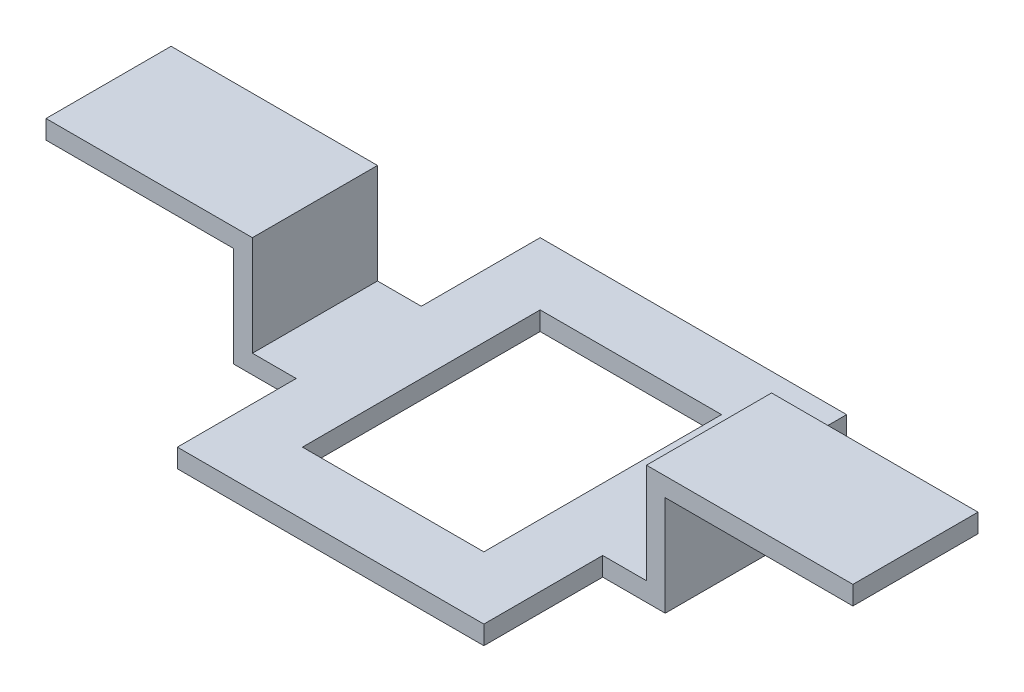
ISO-10303-21;
HEADER;
FILE_DESCRIPTION(('STEP AP214'),'2;1');
FILE_NAME('part.step','',(''),(''),'','','');
FILE_SCHEMA(('AUTOMOTIVE_DESIGN { 1 0 10303 214 1 1 1 1 }'));
ENDSEC;
DATA;
#1=APPLICATION_CONTEXT('core data for automotive mechanical design processes');
#2=APPLICATION_PROTOCOL_DEFINITION('international standard','automotive_design',2000,#1);
#3=PRODUCT_CONTEXT('',#1,'mechanical');
#4=PRODUCT('Part','Part','',(#3));
#5=PRODUCT_RELATED_PRODUCT_CATEGORY('part','',(#4));
#6=PRODUCT_DEFINITION_FORMATION('','',#4);
#7=PRODUCT_DEFINITION_CONTEXT('part definition',#1,'design');
#8=PRODUCT_DEFINITION('design','',#6,#7);
#9=PRODUCT_DEFINITION_SHAPE('','',#8);
#10=(LENGTH_UNIT() NAMED_UNIT(*) SI_UNIT(.MILLI.,.METRE.));
#11=(NAMED_UNIT(*) PLANE_ANGLE_UNIT() SI_UNIT($,.RADIAN.));
#12=(NAMED_UNIT(*) SI_UNIT($,.STERADIAN.) SOLID_ANGLE_UNIT());
#13=UNCERTAINTY_MEASURE_WITH_UNIT(LENGTH_MEASURE(1.E-05),#10,'distance_accuracy_value','');
#14=(GEOMETRIC_REPRESENTATION_CONTEXT(3) GLOBAL_UNCERTAINTY_ASSIGNED_CONTEXT((#13)) GLOBAL_UNIT_ASSIGNED_CONTEXT((#10,
#11,#12)) REPRESENTATION_CONTEXT('',''));
#15=CARTESIAN_POINT('',(0.,0.,0.));
#16=DIRECTION('',(0.,0.,1.));
#17=DIRECTION('',(1.,0.,0.));
#18=AXIS2_PLACEMENT_3D('',#15,#16,#17);
#19=CARTESIAN_POINT('',(34.4999999999998,0.,0.));
#20=DIRECTION('',(1.,0.,0.));
#21=DIRECTION('',(0.,0.,1.));
#22=AXIS2_PLACEMENT_3D('',#19,#20,#21);
#23=PLANE('',#22);
#24=DIRECTION('',(0.,-1.,0.));
#25=VECTOR('',#24,1.);
#26=CARTESIAN_POINT('',(34.4999999999998,3.,-10.));
#27=LINE('',#26,#25);
#28=CARTESIAN_POINT('',(34.4999999999998,16.,-10.));
#29=VERTEX_POINT('',#28);
#30=CARTESIAN_POINT('',(34.4999999999998,0.,-10.));
#31=VERTEX_POINT('',#30);
#32=EDGE_CURVE('E248',#29,#31,#27,.T.);
#33=ORIENTED_EDGE('',*,*,#32,.F.);
#34=DIRECTION('',(0.,0.,1.));
#35=VECTOR('',#34,1.);
#36=CARTESIAN_POINT('',(34.4999999999998,16.,-10.));
#37=LINE('',#36,#35);
#38=CARTESIAN_POINT('',(34.4999999999998,16.,9.99999999999996));
#39=VERTEX_POINT('',#38);
#40=EDGE_CURVE('E220',#29,#39,#37,.T.);
#41=ORIENTED_EDGE('',*,*,#40,.T.);
#42=DIRECTION('',(0.,1.,0.));
#43=VECTOR('',#42,1.);
#44=CARTESIAN_POINT('',(34.4999999999998,0.,9.99999999999997));
#45=LINE('',#44,#43);
#46=CARTESIAN_POINT('',(34.4999999999998,0.,9.99999999999997));
#47=VERTEX_POINT('',#46);
#48=EDGE_CURVE('E241',#47,#39,#45,.T.);
#49=ORIENTED_EDGE('',*,*,#48,.F.);
#50=DIRECTION('',(0.,0.,1.));
#51=VECTOR('',#50,1.);
#52=CARTESIAN_POINT('',(34.4999999999998,0.,-10.));
#53=LINE('',#52,#51);
#54=EDGE_CURVE('E244',#31,#47,#53,.T.);
#55=ORIENTED_EDGE('',*,*,#54,.F.);
#56=EDGE_LOOP('',(#33,#41,#49,#55));
#57=FACE_BOUND('',#56,.T.);
#58=ADVANCED_FACE('F35',(#57),#23,.T.);
#59=CARTESIAN_POINT('',(24.5000000000001,3.,-28.9999999999999));
#60=DIRECTION('',(-1.,0.,0.));
#61=DIRECTION('',(0.,0.,1.));
#62=AXIS2_PLACEMENT_3D('',#59,#60,#61);
#63=PLANE('',#62);
#64=DIRECTION('',(0.,0.,-1.));
#65=VECTOR('',#64,1.);
#66=CARTESIAN_POINT('',(24.5000000000001,0.,-28.9999999999999));
#67=LINE('',#66,#65);
#68=CARTESIAN_POINT('',(24.5000000000001,0.,29.0000000000001));
#69=VERTEX_POINT('',#68);
#70=CARTESIAN_POINT('',(24.4999999999998,0.,9.99999999999998));
#71=VERTEX_POINT('',#70);
#72=EDGE_CURVE('E363',#69,#71,#67,.T.);
#73=ORIENTED_EDGE('',*,*,#72,.T.);
#74=DIRECTION('',(0.,1.,0.));
#75=VECTOR('',#74,1.);
#76=CARTESIAN_POINT('',(24.4999999999998,0.,9.99999999999998));
#77=LINE('',#76,#75);
#78=CARTESIAN_POINT('',(24.4999999999998,3.,9.99999999999997));
#79=VERTEX_POINT('',#78);
#80=EDGE_CURVE('E240',#71,#79,#77,.T.);
#81=ORIENTED_EDGE('',*,*,#80,.T.);
#82=DIRECTION('',(0.,0.,-1.));
#83=VECTOR('',#82,1.);
#84=CARTESIAN_POINT('',(24.5000000000001,3.,-28.9999999999999));
#85=LINE('',#84,#83);
#86=CARTESIAN_POINT('',(24.5000000000001,3.,29.0000000000001));
#87=VERTEX_POINT('',#86);
#88=EDGE_CURVE('E351',#87,#79,#85,.T.);
#89=ORIENTED_EDGE('',*,*,#88,.F.);
#90=DIRECTION('',(0.,-1.,0.));
#91=VECTOR('',#90,1.);
#92=CARTESIAN_POINT('',(24.5000000000001,3.,29.0000000000001));
#93=LINE('',#92,#91);
#94=EDGE_CURVE('E362',#87,#69,#93,.T.);
#95=ORIENTED_EDGE('',*,*,#94,.T.);
#96=EDGE_LOOP('',(#73,#81,#89,#95));
#97=FACE_BOUND('',#96,.T.);
#98=ADVANCED_FACE('F415',(#97),#63,.F.);
#99=CARTESIAN_POINT('',(-24.4999999999998,3.,-28.9999999999999));
#100=DIRECTION('',(1.,0.,0.));
#101=DIRECTION('',(0.,0.,-1.));
#102=AXIS2_PLACEMENT_3D('',#99,#100,#101);
#103=PLANE('',#102);
#104=DIRECTION('',(0.,1.,0.));
#105=VECTOR('',#104,1.);
#106=CARTESIAN_POINT('',(-24.4999999999998,0.,9.99999999999998));
#107=LINE('',#106,#105);
#108=CARTESIAN_POINT('',(-24.4999999999998,0.,9.99999999999996));
#109=VERTEX_POINT('',#108);
#110=CARTESIAN_POINT('',(-24.4999999999998,3.,9.99999999999996));
#111=VERTEX_POINT('',#110);
#112=EDGE_CURVE('E296',#109,#111,#107,.T.);
#113=ORIENTED_EDGE('',*,*,#112,.F.);
#114=DIRECTION('',(0.,0.,1.));
#115=VECTOR('',#114,1.);
#116=CARTESIAN_POINT('',(-24.4999999999998,0.,-28.9999999999999));
#117=LINE('',#116,#115);
#118=CARTESIAN_POINT('',(-24.4999999999999,0.,29.0000000000001));
#119=VERTEX_POINT('',#118);
#120=EDGE_CURVE('E368',#109,#119,#117,.T.);
#121=ORIENTED_EDGE('',*,*,#120,.T.);
#122=DIRECTION('',(0.,-1.,0.));
#123=VECTOR('',#122,1.);
#124=CARTESIAN_POINT('',(-24.4999999999999,3.,29.0000000000001));
#125=LINE('',#124,#123);
#126=CARTESIAN_POINT('',(-24.4999999999999,3.,29.0000000000001));
#127=VERTEX_POINT('',#126);
#128=EDGE_CURVE('E375',#127,#119,#125,.T.);
#129=ORIENTED_EDGE('',*,*,#128,.F.);
#130=DIRECTION('',(0.,0.,1.));
#131=VECTOR('',#130,1.);
#132=CARTESIAN_POINT('',(-24.4999999999998,3.,-28.9999999999999));
#133=LINE('',#132,#131);
#134=EDGE_CURVE('E356',#111,#127,#133,.T.);
#135=ORIENTED_EDGE('',*,*,#134,.F.);
#136=EDGE_LOOP('',(#113,#121,#129,#135));
#137=FACE_BOUND('',#136,.T.);
#138=ADVANCED_FACE('F424',(#137),#103,.F.);
#139=DIRECTION('',(0.,-1.,0.));
#140=VECTOR('',#139,1.);
#141=CARTESIAN_POINT('',(-24.4999999999998,3.,-10.));
#142=LINE('',#141,#140);
#143=CARTESIAN_POINT('',(-24.4999999999998,3.,-10.));
#144=VERTEX_POINT('',#143);
#145=CARTESIAN_POINT('',(-24.4999999999998,0.,-10.));
#146=VERTEX_POINT('',#145);
#147=EDGE_CURVE('E300',#144,#146,#142,.T.);
#148=ORIENTED_EDGE('',*,*,#147,.F.);
#149=CARTESIAN_POINT('',(-24.4999999999998,3.,-28.9999999999999));
#150=VERTEX_POINT('',#149);
#151=EDGE_CURVE('E357',#150,#144,#133,.T.);
#152=ORIENTED_EDGE('',*,*,#151,.F.);
#153=DIRECTION('',(0.,-1.,0.));
#154=VECTOR('',#153,1.);
#155=CARTESIAN_POINT('',(-24.4999999999998,3.,-28.9999999999999));
#156=LINE('',#155,#154);
#157=CARTESIAN_POINT('',(-24.4999999999998,0.,-28.9999999999999));
#158=VERTEX_POINT('',#157);
#159=EDGE_CURVE('E43',#150,#158,#156,.T.);
#160=ORIENTED_EDGE('',*,*,#159,.T.);
#161=EDGE_CURVE('E369',#158,#146,#117,.T.);
#162=ORIENTED_EDGE('',*,*,#161,.T.);
#163=EDGE_LOOP('',(#148,#152,#160,#162));
#164=FACE_BOUND('',#163,.T.);
#165=ADVANCED_FACE('F383',(#164),#103,.F.);
#166=CARTESIAN_POINT('',(24.4999999999998,3.,-10.));
#167=VERTEX_POINT('',#166);
#168=CARTESIAN_POINT('',(24.5000000000001,3.,-28.9999999999999));
#169=VERTEX_POINT('',#168);
#170=EDGE_CURVE('E354',#167,#169,#85,.T.);
#171=ORIENTED_EDGE('',*,*,#170,.F.);
#172=DIRECTION('',(0.,-1.,0.));
#173=VECTOR('',#172,1.);
#174=CARTESIAN_POINT('',(24.4999999999998,3.,-10.));
#175=LINE('',#174,#173);
#176=CARTESIAN_POINT('',(24.5000000000001,0.,-10.));
#177=VERTEX_POINT('',#176);
#178=EDGE_CURVE('E245',#167,#177,#175,.T.);
#179=ORIENTED_EDGE('',*,*,#178,.T.);
#180=CARTESIAN_POINT('',(24.5000000000001,0.,-28.9999999999999));
#181=VERTEX_POINT('',#180);
#182=EDGE_CURVE('E344',#177,#181,#67,.T.);
#183=ORIENTED_EDGE('',*,*,#182,.T.);
#184=DIRECTION('',(0.,-1.,0.));
#185=VECTOR('',#184,1.);
#186=CARTESIAN_POINT('',(24.5000000000001,3.,-28.9999999999999));
#187=LINE('',#186,#185);
#188=EDGE_CURVE('E11',#169,#181,#187,.T.);
#189=ORIENTED_EDGE('',*,*,#188,.F.);
#190=EDGE_LOOP('',(#171,#179,#183,#189));
#191=FACE_BOUND('',#190,.T.);
#192=ADVANCED_FACE('F37',(#191),#63,.F.);
#193=CARTESIAN_POINT('',(-24.4999999999998,3.,-28.9999999999999));
#194=DIRECTION('',(0.,0.,1.));
#195=DIRECTION('',(1.,0.,0.));
#196=AXIS2_PLACEMENT_3D('',#193,#194,#195);
#197=PLANE('',#196);
#198=DIRECTION('',(-1.,0.,0.));
#199=VECTOR('',#198,1.);
#200=CARTESIAN_POINT('',(-24.4999999999998,0.,-28.9999999999999));
#201=LINE('',#200,#199);
#202=EDGE_CURVE('E366',#181,#158,#201,.T.);
#203=ORIENTED_EDGE('',*,*,#202,.T.);
#204=ORIENTED_EDGE('',*,*,#159,.F.);
#205=DIRECTION('',(-1.,0.,0.));
#206=VECTOR('',#205,1.);
#207=CARTESIAN_POINT('',(-24.4999999999998,3.,-28.9999999999999));
#208=LINE('',#207,#206);
#209=EDGE_CURVE('E353',#169,#150,#208,.T.);
#210=ORIENTED_EDGE('',*,*,#209,.F.);
#211=ORIENTED_EDGE('',*,*,#188,.T.);
#212=EDGE_LOOP('',(#203,#204,#210,#211));
#213=FACE_BOUND('',#212,.T.);
#214=ADVANCED_FACE('F402',(#213),#197,.F.);
#215=CARTESIAN_POINT('',(-24.4999999999999,3.,29.0000000000001));
#216=DIRECTION('',(0.,0.,-1.));
#217=DIRECTION('',(-1.,0.,0.));
#218=AXIS2_PLACEMENT_3D('',#215,#216,#217);
#219=PLANE('',#218);
#220=DIRECTION('',(1.,0.,0.));
#221=VECTOR('',#220,1.);
#222=CARTESIAN_POINT('',(-24.4999999999999,0.,29.0000000000001));
#223=LINE('',#222,#221);
#224=EDGE_CURVE('E371',#119,#69,#223,.T.);
#225=ORIENTED_EDGE('',*,*,#224,.T.);
#226=ORIENTED_EDGE('',*,*,#94,.F.);
#227=DIRECTION('',(1.,0.,0.));
#228=VECTOR('',#227,1.);
#229=CARTESIAN_POINT('',(-24.4999999999999,3.,29.0000000000001));
#230=LINE('',#229,#228);
#231=EDGE_CURVE('E360',#127,#87,#230,.T.);
#232=ORIENTED_EDGE('',*,*,#231,.F.);
#233=ORIENTED_EDGE('',*,*,#128,.T.);
#234=EDGE_LOOP('',(#225,#226,#232,#233));
#235=FACE_BOUND('',#234,.T.);
#236=ADVANCED_FACE('F420',(#235),#219,.F.);
#237=CARTESIAN_POINT('',(0.,3.,0.));
#238=DIRECTION('',(0.,1.,0.));
#239=DIRECTION('',(0.,0.,1.));
#240=AXIS2_PLACEMENT_3D('',#237,#238,#239);
#241=PLANE('',#240);
#242=DIRECTION('',(0.,0.,-1.));
#243=VECTOR('',#242,1.);
#244=CARTESIAN_POINT('',(31.4999999999998,3.,-10.));
#245=LINE('',#244,#243);
#246=CARTESIAN_POINT('',(31.4999999999998,3.,9.99999999999997));
#247=VERTEX_POINT('',#246);
#248=CARTESIAN_POINT('',(31.4999999999998,3.,-10.));
#249=VERTEX_POINT('',#248);
#250=EDGE_CURVE('E211',#247,#249,#245,.T.);
#251=ORIENTED_EDGE('',*,*,#250,.T.);
#252=DIRECTION('',(-1.,0.,0.));
#253=VECTOR('',#252,1.);
#254=CARTESIAN_POINT('',(34.4999999999998,3.,-10.));
#255=LINE('',#254,#253);
#256=EDGE_CURVE('E255',#249,#167,#255,.T.);
#257=ORIENTED_EDGE('',*,*,#256,.T.);
#258=ORIENTED_EDGE('',*,*,#170,.T.);
#259=ORIENTED_EDGE('',*,*,#209,.T.);
#260=ORIENTED_EDGE('',*,*,#151,.T.);
#261=DIRECTION('',(1.,0.,0.));
#262=VECTOR('',#261,1.);
#263=CARTESIAN_POINT('',(-34.4999999999998,3.,-10.));
#264=LINE('',#263,#262);
#265=CARTESIAN_POINT('',(-31.4999999999998,3.,-10.));
#266=VERTEX_POINT('',#265);
#267=EDGE_CURVE('E314',#266,#144,#264,.T.);
#268=ORIENTED_EDGE('',*,*,#267,.F.);
#269=DIRECTION('',(0.,0.,-1.));
#270=VECTOR('',#269,1.);
#271=CARTESIAN_POINT('',(-31.4999999999998,3.,-10.));
#272=LINE('',#271,#270);
#273=CARTESIAN_POINT('',(-31.4999999999998,3.,9.99999999999997));
#274=VERTEX_POINT('',#273);
#275=EDGE_CURVE('E281',#274,#266,#272,.T.);
#276=ORIENTED_EDGE('',*,*,#275,.F.);
#277=DIRECTION('',(1.,0.,0.));
#278=VECTOR('',#277,1.);
#279=CARTESIAN_POINT('',(-34.4999999999998,3.,9.99999999999996));
#280=LINE('',#279,#278);
#281=EDGE_CURVE('E316',#274,#111,#280,.T.);
#282=ORIENTED_EDGE('',*,*,#281,.T.);
#283=ORIENTED_EDGE('',*,*,#134,.T.);
#284=ORIENTED_EDGE('',*,*,#231,.T.);
#285=ORIENTED_EDGE('',*,*,#88,.T.);
#286=DIRECTION('',(-1.,0.,0.));
#287=VECTOR('',#286,1.);
#288=CARTESIAN_POINT('',(34.4999999999998,3.,9.99999999999996));
#289=LINE('',#288,#287);
#290=EDGE_CURVE('E58',#247,#79,#289,.T.);
#291=ORIENTED_EDGE('',*,*,#290,.F.);
#292=EDGE_LOOP('',(#251,#257,#258,#259,#260,#268,#276,#282,#283,#284,#285,#291));
#293=FACE_BOUND('',#292,.T.);
#294=DIRECTION('',(0.,0.,-1.));
#295=VECTOR('',#294,1.);
#296=CARTESIAN_POINT('',(14.5,3.,-19.));
#297=LINE('',#296,#295);
#298=CARTESIAN_POINT('',(14.5,3.,19.));
#299=VERTEX_POINT('',#298);
#300=CARTESIAN_POINT('',(14.5,3.,-19.));
#301=VERTEX_POINT('',#300);
#302=EDGE_CURVE('E318',#299,#301,#297,.T.);
#303=ORIENTED_EDGE('',*,*,#302,.F.);
#304=DIRECTION('',(1.,0.,0.));
#305=VECTOR('',#304,1.);
#306=CARTESIAN_POINT('',(-14.5,3.,19.));
#307=LINE('',#306,#305);
#308=CARTESIAN_POINT('',(-14.5,3.,19.));
#309=VERTEX_POINT('',#308);
#310=EDGE_CURVE('E323',#309,#299,#307,.T.);
#311=ORIENTED_EDGE('',*,*,#310,.F.);
#312=DIRECTION('',(0.,0.,1.));
#313=VECTOR('',#312,1.);
#314=CARTESIAN_POINT('',(-14.5,3.,-19.));
#315=LINE('',#314,#313);
#316=CARTESIAN_POINT('',(-14.5,3.,-19.));
#317=VERTEX_POINT('',#316);
#318=EDGE_CURVE('E337',#317,#309,#315,.T.);
#319=ORIENTED_EDGE('',*,*,#318,.F.);
#320=DIRECTION('',(-1.,0.,0.));
#321=VECTOR('',#320,1.);
#322=CARTESIAN_POINT('',(-14.5,3.,-19.));
#323=LINE('',#322,#321);
#324=EDGE_CURVE('E334',#301,#317,#323,.T.);
#325=ORIENTED_EDGE('',*,*,#324,.F.);
#326=EDGE_LOOP('',(#303,#311,#319,#325));
#327=FACE_BOUND('',#326,.T.);
#328=ADVANCED_FACE('F398',(#293,#327),#241,.T.);
#329=CARTESIAN_POINT('',(0.,0.,0.));
#330=DIRECTION('',(0.,1.,0.));
#331=DIRECTION('',(0.,0.,1.));
#332=AXIS2_PLACEMENT_3D('',#329,#330,#331);
#333=PLANE('',#332);
#334=DIRECTION('',(1.,0.,0.));
#335=VECTOR('',#334,1.);
#336=CARTESIAN_POINT('',(-14.5,0.,19.));
#337=LINE('',#336,#335);
#338=CARTESIAN_POINT('',(-14.5,0.,19.));
#339=VERTEX_POINT('',#338);
#340=CARTESIAN_POINT('',(14.5,0.,19.));
#341=VERTEX_POINT('',#340);
#342=EDGE_CURVE('E329',#339,#341,#337,.T.);
#343=ORIENTED_EDGE('',*,*,#342,.T.);
#344=DIRECTION('',(0.,0.,-1.));
#345=VECTOR('',#344,1.);
#346=CARTESIAN_POINT('',(14.5,0.,-19.));
#347=LINE('',#346,#345);
#348=CARTESIAN_POINT('',(14.5,0.,-19.));
#349=VERTEX_POINT('',#348);
#350=EDGE_CURVE('E319',#341,#349,#347,.T.);
#351=ORIENTED_EDGE('',*,*,#350,.T.);
#352=DIRECTION('',(-1.,0.,0.));
#353=VECTOR('',#352,1.);
#354=CARTESIAN_POINT('',(-14.5,0.,-19.));
#355=LINE('',#354,#353);
#356=CARTESIAN_POINT('',(-14.5,0.,-19.));
#357=VERTEX_POINT('',#356);
#358=EDGE_CURVE('E322',#349,#357,#355,.T.);
#359=ORIENTED_EDGE('',*,*,#358,.T.);
#360=DIRECTION('',(0.,0.,1.));
#361=VECTOR('',#360,1.);
#362=CARTESIAN_POINT('',(-14.5,0.,-19.));
#363=LINE('',#362,#361);
#364=EDGE_CURVE('E326',#357,#339,#363,.T.);
#365=ORIENTED_EDGE('',*,*,#364,.T.);
#366=EDGE_LOOP('',(#343,#351,#359,#365));
#367=FACE_BOUND('',#366,.T.);
#368=ORIENTED_EDGE('',*,*,#72,.F.);
#369=ORIENTED_EDGE('',*,*,#224,.F.);
#370=ORIENTED_EDGE('',*,*,#120,.F.);
#371=DIRECTION('',(1.,0.,0.));
#372=VECTOR('',#371,1.);
#373=CARTESIAN_POINT('',(-34.4999999999998,0.,9.99999999999997));
#374=LINE('',#373,#372);
#375=CARTESIAN_POINT('',(-34.4999999999998,0.,9.99999999999997));
#376=VERTEX_POINT('',#375);
#377=EDGE_CURVE('E304',#376,#109,#374,.T.);
#378=ORIENTED_EDGE('',*,*,#377,.F.);
#379=DIRECTION('',(0.,0.,1.));
#380=VECTOR('',#379,1.);
#381=CARTESIAN_POINT('',(-34.4999999999998,0.,-10.));
#382=LINE('',#381,#380);
#383=CARTESIAN_POINT('',(-34.4999999999998,0.,-10.));
#384=VERTEX_POINT('',#383);
#385=EDGE_CURVE('E302',#384,#376,#382,.T.);
#386=ORIENTED_EDGE('',*,*,#385,.F.);
#387=DIRECTION('',(1.,0.,0.));
#388=VECTOR('',#387,1.);
#389=CARTESIAN_POINT('',(-34.4999999999998,0.,-10.));
#390=LINE('',#389,#388);
#391=EDGE_CURVE('E311',#384,#146,#390,.T.);
#392=ORIENTED_EDGE('',*,*,#391,.T.);
#393=ORIENTED_EDGE('',*,*,#161,.F.);
#394=ORIENTED_EDGE('',*,*,#202,.F.);
#395=ORIENTED_EDGE('',*,*,#182,.F.);
#396=DIRECTION('',(-1.,0.,0.));
#397=VECTOR('',#396,1.);
#398=CARTESIAN_POINT('',(34.4999999999998,0.,-10.));
#399=LINE('',#398,#397);
#400=EDGE_CURVE('E257',#31,#177,#399,.T.);
#401=ORIENTED_EDGE('',*,*,#400,.F.);
#402=ORIENTED_EDGE('',*,*,#54,.T.);
#403=DIRECTION('',(-1.,0.,0.));
#404=VECTOR('',#403,1.);
#405=CARTESIAN_POINT('',(34.4999999999998,0.,9.99999999999997));
#406=LINE('',#405,#404);
#407=EDGE_CURVE('E259',#47,#71,#406,.T.);
#408=ORIENTED_EDGE('',*,*,#407,.T.);
#409=EDGE_LOOP('',(#368,#369,#370,#378,#386,#392,#393,#394,#395,#401,#402,#408));
#410=FACE_BOUND('',#409,.T.);
#411=ADVANCED_FACE('F389',(#367,#410),#333,.F.);
#412=CARTESIAN_POINT('',(14.5,0.,-19.));
#413=DIRECTION('',(1.,0.,0.));
#414=DIRECTION('',(0.,0.,-1.));
#415=AXIS2_PLACEMENT_3D('',#412,#413,#414);
#416=PLANE('',#415);
#417=ORIENTED_EDGE('',*,*,#302,.T.);
#418=DIRECTION('',(0.,1.,0.));
#419=VECTOR('',#418,1.);
#420=CARTESIAN_POINT('',(14.5,0.,-19.));
#421=LINE('',#420,#419);
#422=EDGE_CURVE('E332',#349,#301,#421,.T.);
#423=ORIENTED_EDGE('',*,*,#422,.F.);
#424=ORIENTED_EDGE('',*,*,#350,.F.);
#425=DIRECTION('',(0.,1.,0.));
#426=VECTOR('',#425,1.);
#427=CARTESIAN_POINT('',(14.5,0.,19.));
#428=LINE('',#427,#426);
#429=EDGE_CURVE('E342',#341,#299,#428,.T.);
#430=ORIENTED_EDGE('',*,*,#429,.T.);
#431=EDGE_LOOP('',(#417,#423,#424,#430));
#432=FACE_BOUND('',#431,.T.);
#433=ADVANCED_FACE('F572',(#432),#416,.F.);
#434=CARTESIAN_POINT('',(-14.5,0.,19.));
#435=DIRECTION('',(0.,0.,1.));
#436=DIRECTION('',(1.,0.,0.));
#437=AXIS2_PLACEMENT_3D('',#434,#435,#436);
#438=PLANE('',#437);
#439=ORIENTED_EDGE('',*,*,#310,.T.);
#440=ORIENTED_EDGE('',*,*,#429,.F.);
#441=ORIENTED_EDGE('',*,*,#342,.F.);
#442=DIRECTION('',(0.,1.,0.));
#443=VECTOR('',#442,1.);
#444=CARTESIAN_POINT('',(-14.5,0.,19.));
#445=LINE('',#444,#443);
#446=EDGE_CURVE('E345',#339,#309,#445,.T.);
#447=ORIENTED_EDGE('',*,*,#446,.T.);
#448=EDGE_LOOP('',(#439,#440,#441,#447));
#449=FACE_BOUND('',#448,.T.);
#450=ADVANCED_FACE('F583',(#449),#438,.F.);
#451=CARTESIAN_POINT('',(-14.5,0.,-19.));
#452=DIRECTION('',(-1.,0.,0.));
#453=DIRECTION('',(0.,0.,1.));
#454=AXIS2_PLACEMENT_3D('',#451,#452,#453);
#455=PLANE('',#454);
#456=ORIENTED_EDGE('',*,*,#318,.T.);
#457=ORIENTED_EDGE('',*,*,#446,.F.);
#458=ORIENTED_EDGE('',*,*,#364,.F.);
#459=DIRECTION('',(0.,1.,0.));
#460=VECTOR('',#459,1.);
#461=CARTESIAN_POINT('',(-14.5,0.,-19.));
#462=LINE('',#461,#460);
#463=EDGE_CURVE('E347',#357,#317,#462,.T.);
#464=ORIENTED_EDGE('',*,*,#463,.T.);
#465=EDGE_LOOP('',(#456,#457,#458,#464));
#466=FACE_BOUND('',#465,.T.);
#467=ADVANCED_FACE('F592',(#466),#455,.F.);
#468=CARTESIAN_POINT('',(-14.5,0.,-19.));
#469=DIRECTION('',(0.,0.,-1.));
#470=DIRECTION('',(-1.,0.,0.));
#471=AXIS2_PLACEMENT_3D('',#468,#469,#470);
#472=PLANE('',#471);
#473=ORIENTED_EDGE('',*,*,#324,.T.);
#474=ORIENTED_EDGE('',*,*,#463,.F.);
#475=ORIENTED_EDGE('',*,*,#358,.F.);
#476=ORIENTED_EDGE('',*,*,#422,.T.);
#477=EDGE_LOOP('',(#473,#474,#475,#476));
#478=FACE_BOUND('',#477,.T.);
#479=ADVANCED_FACE('F600',(#478),#472,.F.);
#480=CARTESIAN_POINT('',(-34.4999999999998,0.,9.99999999999997));
#481=DIRECTION('',(0.,0.,-1.));
#482=DIRECTION('',(-1.,0.,0.));
#483=AXIS2_PLACEMENT_3D('',#480,#481,#482);
#484=PLANE('',#483);
#485=ORIENTED_EDGE('',*,*,#112,.T.);
#486=ORIENTED_EDGE('',*,*,#281,.F.);
#487=DIRECTION('',(0.,-1.,0.));
#488=VECTOR('',#487,1.);
#489=CARTESIAN_POINT('',(-31.4999999999998,19.,9.99999999999996));
#490=LINE('',#489,#488);
#491=CARTESIAN_POINT('',(-31.4999999999998,19.,9.99999999999996));
#492=VERTEX_POINT('',#491);
#493=EDGE_CURVE('E293',#492,#274,#490,.T.);
#494=ORIENTED_EDGE('',*,*,#493,.F.);
#495=DIRECTION('',(1.,0.,0.));
#496=VECTOR('',#495,1.);
#497=CARTESIAN_POINT('',(-34.4999999999998,19.,9.99999999999996));
#498=LINE('',#497,#496);
#499=CARTESIAN_POINT('',(-64.4999999999998,19.,9.99999999999993));
#500=VERTEX_POINT('',#499);
#501=EDGE_CURVE('E282',#500,#492,#498,.T.);
#502=ORIENTED_EDGE('',*,*,#501,.F.);
#503=DIRECTION('',(0.,1.,0.));
#504=VECTOR('',#503,1.);
#505=CARTESIAN_POINT('',(-64.4999999999998,19.,9.99999999999993));
#506=LINE('',#505,#504);
#507=CARTESIAN_POINT('',(-64.4999999999998,16.,9.99999999999993));
#508=VERTEX_POINT('',#507);
#509=EDGE_CURVE('E267',#508,#500,#506,.T.);
#510=ORIENTED_EDGE('',*,*,#509,.F.);
#511=DIRECTION('',(1.,0.,0.));
#512=VECTOR('',#511,1.);
#513=CARTESIAN_POINT('',(-64.4999999999998,16.,9.99999999999993));
#514=LINE('',#513,#512);
#515=CARTESIAN_POINT('',(-34.4999999999998,16.,9.99999999999996));
#516=VERTEX_POINT('',#515);
#517=EDGE_CURVE('E273',#508,#516,#514,.T.);
#518=ORIENTED_EDGE('',*,*,#517,.T.);
#519=DIRECTION('',(0.,1.,0.));
#520=VECTOR('',#519,1.);
#521=CARTESIAN_POINT('',(-34.4999999999998,0.,9.99999999999997));
#522=LINE('',#521,#520);
#523=EDGE_CURVE('E297',#376,#516,#522,.T.);
#524=ORIENTED_EDGE('',*,*,#523,.F.);
#525=ORIENTED_EDGE('',*,*,#377,.T.);
#526=EDGE_LOOP('',(#485,#486,#494,#502,#510,#518,#524,#525));
#527=FACE_BOUND('',#526,.T.);
#528=ADVANCED_FACE('F427',(#527),#484,.F.);
#529=CARTESIAN_POINT('',(-34.4999999999998,3.,-10.));
#530=DIRECTION('',(0.,0.,1.));
#531=DIRECTION('',(1.,0.,0.));
#532=AXIS2_PLACEMENT_3D('',#529,#530,#531);
#533=PLANE('',#532);
#534=ORIENTED_EDGE('',*,*,#147,.T.);
#535=ORIENTED_EDGE('',*,*,#391,.F.);
#536=DIRECTION('',(0.,-1.,0.));
#537=VECTOR('',#536,1.);
#538=CARTESIAN_POINT('',(-34.4999999999998,3.,-10.));
#539=LINE('',#538,#537);
#540=CARTESIAN_POINT('',(-34.4999999999998,16.,-10.));
#541=VERTEX_POINT('',#540);
#542=EDGE_CURVE('E299',#541,#384,#539,.T.);
#543=ORIENTED_EDGE('',*,*,#542,.F.);
#544=DIRECTION('',(1.,0.,0.));
#545=VECTOR('',#544,1.);
#546=CARTESIAN_POINT('',(-64.4999999999998,16.,-10.0000000000001));
#547=LINE('',#546,#545);
#548=CARTESIAN_POINT('',(-64.4999999999998,16.,-10.0000000000001));
#549=VERTEX_POINT('',#548);
#550=EDGE_CURVE('E278',#549,#541,#547,.T.);
#551=ORIENTED_EDGE('',*,*,#550,.F.);
#552=DIRECTION('',(0.,-1.,0.));
#553=VECTOR('',#552,1.);
#554=CARTESIAN_POINT('',(-64.4999999999998,19.,-10.0000000000001));
#555=LINE('',#554,#553);
#556=CARTESIAN_POINT('',(-64.4999999999998,19.,-10.0000000000001));
#557=VERTEX_POINT('',#556);
#558=EDGE_CURVE('E262',#557,#549,#555,.T.);
#559=ORIENTED_EDGE('',*,*,#558,.F.);
#560=DIRECTION('',(-1.,0.,0.));
#561=VECTOR('',#560,1.);
#562=CARTESIAN_POINT('',(-34.4999999999998,19.,-10.));
#563=LINE('',#562,#561);
#564=CARTESIAN_POINT('',(-31.4999999999998,19.,-10.));
#565=VERTEX_POINT('',#564);
#566=EDGE_CURVE('E286',#565,#557,#563,.T.);
#567=ORIENTED_EDGE('',*,*,#566,.F.);
#568=DIRECTION('',(0.,-1.,0.));
#569=VECTOR('',#568,1.);
#570=CARTESIAN_POINT('',(-31.4999999999998,19.,-10.));
#571=LINE('',#570,#569);
#572=EDGE_CURVE('E288',#565,#266,#571,.T.);
#573=ORIENTED_EDGE('',*,*,#572,.T.);
#574=ORIENTED_EDGE('',*,*,#267,.T.);
#575=EDGE_LOOP('',(#534,#535,#543,#551,#559,#567,#573,#574));
#576=FACE_BOUND('',#575,.T.);
#577=ADVANCED_FACE('F396',(#576),#533,.F.);
#578=CARTESIAN_POINT('',(-34.4999999999998,0.,0.));
#579=DIRECTION('',(-1.,0.,0.));
#580=DIRECTION('',(0.,0.,1.));
#581=AXIS2_PLACEMENT_3D('',#578,#579,#580);
#582=PLANE('',#581);
#583=DIRECTION('',(0.,0.,1.));
#584=VECTOR('',#583,1.);
#585=CARTESIAN_POINT('',(-34.4999999999998,16.,-10.));
#586=LINE('',#585,#584);
#587=EDGE_CURVE('E261',#541,#516,#586,.T.);
#588=ORIENTED_EDGE('',*,*,#587,.F.);
#589=ORIENTED_EDGE('',*,*,#542,.T.);
#590=ORIENTED_EDGE('',*,*,#385,.T.);
#591=ORIENTED_EDGE('',*,*,#523,.T.);
#592=EDGE_LOOP('',(#588,#589,#590,#591));
#593=FACE_BOUND('',#592,.T.);
#594=ADVANCED_FACE('F432',(#593),#582,.T.);
#595=CARTESIAN_POINT('',(-31.4999999999998,19.,-10.));
#596=DIRECTION('',(-1.,0.,0.));
#597=DIRECTION('',(0.,0.,1.));
#598=AXIS2_PLACEMENT_3D('',#595,#596,#597);
#599=PLANE('',#598);
#600=ORIENTED_EDGE('',*,*,#275,.T.);
#601=ORIENTED_EDGE('',*,*,#572,.F.);
#602=DIRECTION('',(0.,0.,-1.));
#603=VECTOR('',#602,1.);
#604=CARTESIAN_POINT('',(-31.4999999999998,19.,-10.));
#605=LINE('',#604,#603);
#606=EDGE_CURVE('E284',#492,#565,#605,.T.);
#607=ORIENTED_EDGE('',*,*,#606,.F.);
#608=ORIENTED_EDGE('',*,*,#493,.T.);
#609=EDGE_LOOP('',(#600,#601,#607,#608));
#610=FACE_BOUND('',#609,.T.);
#611=ADVANCED_FACE('F446',(#610),#599,.F.);
#612=CARTESIAN_POINT('',(0.,19.,0.));
#613=DIRECTION('',(0.,1.,0.));
#614=DIRECTION('',(0.,0.,1.));
#615=AXIS2_PLACEMENT_3D('',#612,#613,#614);
#616=PLANE('',#615);
#617=ORIENTED_EDGE('',*,*,#566,.T.);
#618=DIRECTION('',(0.,0.,-1.));
#619=VECTOR('',#618,1.);
#620=CARTESIAN_POINT('',(-64.4999999999998,19.,-10.0000000000001));
#621=LINE('',#620,#619);
#622=EDGE_CURVE('E270',#500,#557,#621,.T.);
#623=ORIENTED_EDGE('',*,*,#622,.F.);
#624=ORIENTED_EDGE('',*,*,#501,.T.);
#625=ORIENTED_EDGE('',*,*,#606,.T.);
#626=EDGE_LOOP('',(#617,#623,#624,#625));
#627=FACE_BOUND('',#626,.T.);
#628=ADVANCED_FACE('F441',(#627),#616,.T.);
#629=CARTESIAN_POINT('',(-64.4999999999998,16.,-10.0000000000001));
#630=DIRECTION('',(0.,1.,0.));
#631=DIRECTION('',(-1.,0.,0.));
#632=AXIS2_PLACEMENT_3D('',#629,#630,#631);
#633=PLANE('',#632);
#634=ORIENTED_EDGE('',*,*,#587,.T.);
#635=ORIENTED_EDGE('',*,*,#517,.F.);
#636=DIRECTION('',(0.,0.,1.));
#637=VECTOR('',#636,1.);
#638=CARTESIAN_POINT('',(-64.4999999999998,16.,-10.0000000000001));
#639=LINE('',#638,#637);
#640=EDGE_CURVE('E265',#549,#508,#639,.T.);
#641=ORIENTED_EDGE('',*,*,#640,.F.);
#642=ORIENTED_EDGE('',*,*,#550,.T.);
#643=EDGE_LOOP('',(#634,#635,#641,#642));
#644=FACE_BOUND('',#643,.T.);
#645=ADVANCED_FACE('F434',(#644),#633,.F.);
#646=CARTESIAN_POINT('',(-64.4999999999998,0.,0.));
#647=DIRECTION('',(-1.,0.,0.));
#648=DIRECTION('',(0.,0.,1.));
#649=AXIS2_PLACEMENT_3D('',#646,#647,#648);
#650=PLANE('',#649);
#651=ORIENTED_EDGE('',*,*,#558,.T.);
#652=ORIENTED_EDGE('',*,*,#640,.T.);
#653=ORIENTED_EDGE('',*,*,#509,.T.);
#654=ORIENTED_EDGE('',*,*,#622,.T.);
#655=EDGE_LOOP('',(#651,#652,#653,#654));
#656=FACE_BOUND('',#655,.T.);
#657=ADVANCED_FACE('F438',(#656),#650,.T.);
#658=CARTESIAN_POINT('',(34.4999999999998,0.,9.99999999999997));
#659=DIRECTION('',(0.,0.,1.));
#660=DIRECTION('',(1.,0.,0.));
#661=AXIS2_PLACEMENT_3D('',#658,#659,#660);
#662=PLANE('',#661);
#663=ORIENTED_EDGE('',*,*,#80,.F.);
#664=ORIENTED_EDGE('',*,*,#407,.F.);
#665=ORIENTED_EDGE('',*,*,#48,.T.);
#666=DIRECTION('',(-1.,0.,0.));
#667=VECTOR('',#666,1.);
#668=CARTESIAN_POINT('',(64.4999999999998,16.,9.99999999999993));
#669=LINE('',#668,#667);
#670=CARTESIAN_POINT('',(64.4999999999998,16.,9.99999999999993));
#671=VERTEX_POINT('',#670);
#672=EDGE_CURVE('E50',#671,#39,#669,.T.);
#673=ORIENTED_EDGE('',*,*,#672,.F.);
#674=DIRECTION('',(0.,1.,0.));
#675=VECTOR('',#674,1.);
#676=CARTESIAN_POINT('',(64.4999999999998,19.,9.99999999999993));
#677=LINE('',#676,#675);
#678=CARTESIAN_POINT('',(64.4999999999998,19.,9.99999999999993));
#679=VERTEX_POINT('',#678);
#680=EDGE_CURVE('E225',#671,#679,#677,.T.);
#681=ORIENTED_EDGE('',*,*,#680,.T.);
#682=DIRECTION('',(-1.,0.,0.));
#683=VECTOR('',#682,1.);
#684=CARTESIAN_POINT('',(34.4999999999998,19.,9.99999999999996));
#685=LINE('',#684,#683);
#686=CARTESIAN_POINT('',(31.4999999999998,19.,9.99999999999996));
#687=VERTEX_POINT('',#686);
#688=EDGE_CURVE('E224',#679,#687,#685,.T.);
#689=ORIENTED_EDGE('',*,*,#688,.T.);
#690=DIRECTION('',(0.,-1.,0.));
#691=VECTOR('',#690,1.);
#692=CARTESIAN_POINT('',(31.4999999999998,19.,9.99999999999996));
#693=LINE('',#692,#691);
#694=EDGE_CURVE('E236',#687,#247,#693,.T.);
#695=ORIENTED_EDGE('',*,*,#694,.T.);
#696=ORIENTED_EDGE('',*,*,#290,.T.);
#697=EDGE_LOOP('',(#663,#664,#665,#673,#681,#689,#695,#696));
#698=FACE_BOUND('',#697,.T.);
#699=ADVANCED_FACE('F411',(#698),#662,.T.);
#700=CARTESIAN_POINT('',(34.4999999999998,3.,-10.));
#701=DIRECTION('',(0.,0.,-1.));
#702=DIRECTION('',(-1.,0.,0.));
#703=AXIS2_PLACEMENT_3D('',#700,#701,#702);
#704=PLANE('',#703);
#705=ORIENTED_EDGE('',*,*,#178,.F.);
#706=ORIENTED_EDGE('',*,*,#256,.F.);
#707=DIRECTION('',(0.,-1.,0.));
#708=VECTOR('',#707,1.);
#709=CARTESIAN_POINT('',(31.4999999999998,19.,-10.));
#710=LINE('',#709,#708);
#711=CARTESIAN_POINT('',(31.4999999999998,19.,-10.));
#712=VERTEX_POINT('',#711);
#713=EDGE_CURVE('E205',#712,#249,#710,.T.);
#714=ORIENTED_EDGE('',*,*,#713,.F.);
#715=DIRECTION('',(1.,0.,0.));
#716=VECTOR('',#715,1.);
#717=CARTESIAN_POINT('',(34.4999999999998,19.,-10.));
#718=LINE('',#717,#716);
#719=CARTESIAN_POINT('',(64.4999999999998,19.,-10.0000000000001));
#720=VERTEX_POINT('',#719);
#721=EDGE_CURVE('E197',#712,#720,#718,.T.);
#722=ORIENTED_EDGE('',*,*,#721,.T.);
#723=DIRECTION('',(0.,-1.,0.));
#724=VECTOR('',#723,1.);
#725=CARTESIAN_POINT('',(64.4999999999998,19.,-10.0000000000001));
#726=LINE('',#725,#724);
#727=CARTESIAN_POINT('',(64.4999999999998,16.,-10.0000000000001));
#728=VERTEX_POINT('',#727);
#729=EDGE_CURVE('E201',#720,#728,#726,.T.);
#730=ORIENTED_EDGE('',*,*,#729,.T.);
#731=DIRECTION('',(-1.,0.,0.));
#732=VECTOR('',#731,1.);
#733=CARTESIAN_POINT('',(64.4999999999998,16.,-10.0000000000001));
#734=LINE('',#733,#732);
#735=EDGE_CURVE('E230',#728,#29,#734,.T.);
#736=ORIENTED_EDGE('',*,*,#735,.T.);
#737=ORIENTED_EDGE('',*,*,#32,.T.);
#738=ORIENTED_EDGE('',*,*,#400,.T.);
#739=EDGE_LOOP('',(#705,#706,#714,#722,#730,#736,#737,#738));
#740=FACE_BOUND('',#739,.T.);
#741=ADVANCED_FACE('F200',(#740),#704,.T.);
#742=CARTESIAN_POINT('',(31.4999999999998,19.,-10.));
#743=DIRECTION('',(-1.,0.,0.));
#744=DIRECTION('',(0.,0.,1.));
#745=AXIS2_PLACEMENT_3D('',#742,#743,#744);
#746=PLANE('',#745);
#747=ORIENTED_EDGE('',*,*,#250,.F.);
#748=ORIENTED_EDGE('',*,*,#694,.F.);
#749=DIRECTION('',(0.,0.,-1.));
#750=VECTOR('',#749,1.);
#751=CARTESIAN_POINT('',(31.4999999999998,19.,-10.));
#752=LINE('',#751,#750);
#753=EDGE_CURVE('E210',#687,#712,#752,.T.);
#754=ORIENTED_EDGE('',*,*,#753,.T.);
#755=ORIENTED_EDGE('',*,*,#713,.T.);
#756=EDGE_LOOP('',(#747,#748,#754,#755));
#757=FACE_BOUND('',#756,.T.);
#758=ADVANCED_FACE('F462',(#757),#746,.T.);
#759=CARTESIAN_POINT('',(0.,19.,0.));
#760=DIRECTION('',(0.,1.,0.));
#761=DIRECTION('',(0.,0.,1.));
#762=AXIS2_PLACEMENT_3D('',#759,#760,#761);
#763=PLANE('',#762);
#764=ORIENTED_EDGE('',*,*,#688,.F.);
#765=DIRECTION('',(0.,0.,-1.));
#766=VECTOR('',#765,1.);
#767=CARTESIAN_POINT('',(64.4999999999998,19.,-10.0000000000001));
#768=LINE('',#767,#766);
#769=EDGE_CURVE('E217',#679,#720,#768,.T.);
#770=ORIENTED_EDGE('',*,*,#769,.T.);
#771=ORIENTED_EDGE('',*,*,#721,.F.);
#772=ORIENTED_EDGE('',*,*,#753,.F.);
#773=EDGE_LOOP('',(#764,#770,#771,#772));
#774=FACE_BOUND('',#773,.T.);
#775=ADVANCED_FACE('F222',(#774),#763,.T.);
#776=CARTESIAN_POINT('',(64.4999999999998,16.,-10.0000000000001));
#777=DIRECTION('',(0.,-1.,0.));
#778=DIRECTION('',(1.,0.,0.));
#779=AXIS2_PLACEMENT_3D('',#776,#777,#778);
#780=PLANE('',#779);
#781=ORIENTED_EDGE('',*,*,#40,.F.);
#782=ORIENTED_EDGE('',*,*,#735,.F.);
#783=DIRECTION('',(0.,0.,1.));
#784=VECTOR('',#783,1.);
#785=CARTESIAN_POINT('',(64.4999999999998,16.,-10.0000000000001));
#786=LINE('',#785,#784);
#787=EDGE_CURVE('E219',#728,#671,#786,.T.);
#788=ORIENTED_EDGE('',*,*,#787,.T.);
#789=ORIENTED_EDGE('',*,*,#672,.T.);
#790=EDGE_LOOP('',(#781,#782,#788,#789));
#791=FACE_BOUND('',#790,.T.);
#792=ADVANCED_FACE('F500',(#791),#780,.T.);
#793=CARTESIAN_POINT('',(64.4999999999998,0.,0.));
#794=DIRECTION('',(1.,0.,0.));
#795=DIRECTION('',(0.,0.,1.));
#796=AXIS2_PLACEMENT_3D('',#793,#794,#795);
#797=PLANE('',#796);
#798=ORIENTED_EDGE('',*,*,#729,.F.);
#799=ORIENTED_EDGE('',*,*,#769,.F.);
#800=ORIENTED_EDGE('',*,*,#680,.F.);
#801=ORIENTED_EDGE('',*,*,#787,.F.);
#802=EDGE_LOOP('',(#798,#799,#800,#801));
#803=FACE_BOUND('',#802,.T.);
#804=ADVANCED_FACE('F215',(#803),#797,.T.);
#805=CLOSED_SHELL('',(#58,#98,#138,#165,#192,#214,#236,#328,#411,#433,#450,#467,#479,#528,#577,
#594,#611,#628,#645,#657,#699,#741,#758,#775,#792,#804));
#806=MANIFOLD_SOLID_BREP('B2',#805);
#807=ADVANCED_BREP_SHAPE_REPRESENTATION('',(#18,#806),#14);
#808=SHAPE_DEFINITION_REPRESENTATION(#9,#807);
ENDSEC;
END-ISO-10303-21;
